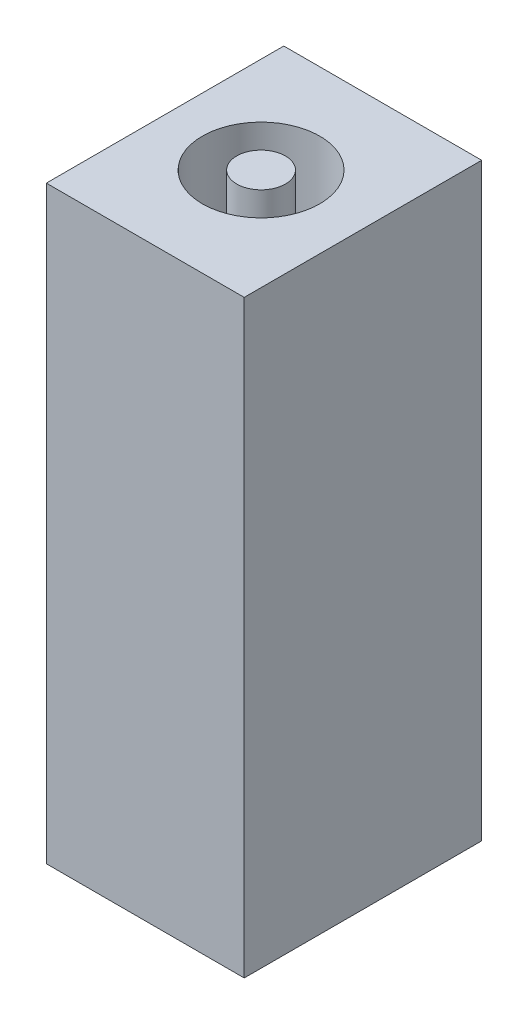
ISO-10303-21;
HEADER;
FILE_DESCRIPTION(('STEP AP214'),'2;1');
FILE_NAME('part.step','',(''),(''),'','','');
FILE_SCHEMA(('AUTOMOTIVE_DESIGN { 1 0 10303 214 1 1 1 1 }'));
ENDSEC;
DATA;
#1=APPLICATION_CONTEXT('core data for automotive mechanical design processes');
#2=APPLICATION_PROTOCOL_DEFINITION('international standard','automotive_design',2000,#1);
#3=PRODUCT_CONTEXT('',#1,'mechanical');
#4=PRODUCT('Part','Part','',(#3));
#5=PRODUCT_RELATED_PRODUCT_CATEGORY('part','',(#4));
#6=PRODUCT_DEFINITION_FORMATION('','',#4);
#7=PRODUCT_DEFINITION_CONTEXT('part definition',#1,'design');
#8=PRODUCT_DEFINITION('design','',#6,#7);
#9=PRODUCT_DEFINITION_SHAPE('','',#8);
#10=(LENGTH_UNIT() NAMED_UNIT(*) SI_UNIT(.MILLI.,.METRE.));
#11=(NAMED_UNIT(*) PLANE_ANGLE_UNIT() SI_UNIT($,.RADIAN.));
#12=(NAMED_UNIT(*) SI_UNIT($,.STERADIAN.) SOLID_ANGLE_UNIT());
#13=UNCERTAINTY_MEASURE_WITH_UNIT(LENGTH_MEASURE(1.E-05),#10,'distance_accuracy_value','');
#14=(GEOMETRIC_REPRESENTATION_CONTEXT(3) GLOBAL_UNCERTAINTY_ASSIGNED_CONTEXT((#13)) GLOBAL_UNIT_ASSIGNED_CONTEXT((#10,
#11,#12)) REPRESENTATION_CONTEXT('',''));
#15=CARTESIAN_POINT('',(0.,0.,0.));
#16=DIRECTION('',(0.,0.,1.));
#17=DIRECTION('',(1.,0.,0.));
#18=AXIS2_PLACEMENT_3D('',#15,#16,#17);
#19=CARTESIAN_POINT('',(25.,37.2340425531915,-15.));
#20=DIRECTION('',(0.,0.,1.));
#21=DIRECTION('',(0.,-1.,0.));
#22=AXIS2_PLACEMENT_3D('',#19,#20,#21);
#23=PLANE('',#22);
#24=DIRECTION('',(0.,1.,0.));
#25=VECTOR('',#24,1.);
#26=CARTESIAN_POINT('',(0.,37.2340425531915,-15.));
#27=LINE('',#26,#25);
#28=CARTESIAN_POINT('',(0.,-37.2340425531915,-15.));
#29=VERTEX_POINT('',#28);
#30=CARTESIAN_POINT('',(0.,37.2340425531915,-15.));
#31=VERTEX_POINT('',#30);
#32=EDGE_CURVE('E111',#29,#31,#27,.T.);
#33=ORIENTED_EDGE('',*,*,#32,.T.);
#34=DIRECTION('',(-1.,0.,0.));
#35=VECTOR('',#34,1.);
#36=CARTESIAN_POINT('',(25.,37.2340425531915,-15.));
#37=LINE('',#36,#35);
#38=CARTESIAN_POINT('',(25.,37.2340425531915,-15.));
#39=VERTEX_POINT('',#38);
#40=EDGE_CURVE('E11',#39,#31,#37,.T.);
#41=ORIENTED_EDGE('',*,*,#40,.F.);
#42=DIRECTION('',(0.,1.,0.));
#43=VECTOR('',#42,1.);
#44=CARTESIAN_POINT('',(25.,37.2340425531915,-15.));
#45=LINE('',#44,#43);
#46=CARTESIAN_POINT('',(25.,-37.2340425531915,-15.));
#47=VERTEX_POINT('',#46);
#48=EDGE_CURVE('E95',#47,#39,#45,.T.);
#49=ORIENTED_EDGE('',*,*,#48,.F.);
#50=DIRECTION('',(-1.,0.,0.));
#51=VECTOR('',#50,1.);
#52=CARTESIAN_POINT('',(25.,-37.2340425531915,-15.));
#53=LINE('',#52,#51);
#54=EDGE_CURVE('E107',#47,#29,#53,.T.);
#55=ORIENTED_EDGE('',*,*,#54,.T.);
#56=EDGE_LOOP('',(#33,#41,#49,#55));
#57=FACE_BOUND('',#56,.T.);
#58=ADVANCED_FACE('F43',(#57),#23,.F.);
#59=CARTESIAN_POINT('',(25.,37.2340425531915,15.));
#60=DIRECTION('',(0.,-1.,0.));
#61=DIRECTION('',(0.,0.,-1.));
#62=AXIS2_PLACEMENT_3D('',#59,#60,#61);
#63=PLANE('',#62);
#64=CARTESIAN_POINT('',(12.1285508275323,37.2340425531915,0.));
#65=DIRECTION('',(0.,1.,0.));
#66=DIRECTION('',(0.,0.,1.));
#67=AXIS2_PLACEMENT_3D('',#64,#65,#66);
#68=CIRCLE('',#67,7.415);
#69=CARTESIAN_POINT('',(12.1285508275323,37.2340425531915,7.415));
#70=VERTEX_POINT('',#69);
#71=EDGE_CURVE('E132',#70,#70,#68,.T.);
#72=ORIENTED_EDGE('',*,*,#71,.F.);
#73=EDGE_LOOP('',(#72));
#74=FACE_BOUND('',#73,.T.);
#75=DIRECTION('',(0.,0.,1.));
#76=VECTOR('',#75,1.);
#77=CARTESIAN_POINT('',(0.,37.2340425531915,15.));
#78=LINE('',#77,#76);
#79=CARTESIAN_POINT('',(0.,37.2340425531915,15.));
#80=VERTEX_POINT('',#79);
#81=EDGE_CURVE('E100',#31,#80,#78,.T.);
#82=ORIENTED_EDGE('',*,*,#81,.T.);
#83=DIRECTION('',(-1.,0.,0.));
#84=VECTOR('',#83,1.);
#85=CARTESIAN_POINT('',(25.,37.2340425531915,15.));
#86=LINE('',#85,#84);
#87=CARTESIAN_POINT('',(25.,37.2340425531915,15.));
#88=VERTEX_POINT('',#87);
#89=EDGE_CURVE('E52',#88,#80,#86,.T.);
#90=ORIENTED_EDGE('',*,*,#89,.F.);
#91=DIRECTION('',(0.,0.,1.));
#92=VECTOR('',#91,1.);
#93=CARTESIAN_POINT('',(25.,37.2340425531915,15.));
#94=LINE('',#93,#92);
#95=EDGE_CURVE('E90',#39,#88,#94,.T.);
#96=ORIENTED_EDGE('',*,*,#95,.F.);
#97=ORIENTED_EDGE('',*,*,#40,.T.);
#98=EDGE_LOOP('',(#82,#90,#96,#97));
#99=FACE_BOUND('',#98,.T.);
#100=ADVANCED_FACE('F99',(#74,#99),#63,.F.);
#101=CARTESIAN_POINT('',(25.,37.2340425531915,15.));
#102=DIRECTION('',(0.,0.,-1.));
#103=DIRECTION('',(0.,1.,0.));
#104=AXIS2_PLACEMENT_3D('',#101,#102,#103);
#105=PLANE('',#104);
#106=DIRECTION('',(0.,-1.,0.));
#107=VECTOR('',#106,1.);
#108=CARTESIAN_POINT('',(0.,37.2340425531915,15.));
#109=LINE('',#108,#107);
#110=CARTESIAN_POINT('',(0.,-37.2340425531915,15.));
#111=VERTEX_POINT('',#110);
#112=EDGE_CURVE('E77',#80,#111,#109,.T.);
#113=ORIENTED_EDGE('',*,*,#112,.T.);
#114=DIRECTION('',(-1.,0.,0.));
#115=VECTOR('',#114,1.);
#116=CARTESIAN_POINT('',(25.,-37.2340425531915,15.));
#117=LINE('',#116,#115);
#118=CARTESIAN_POINT('',(25.,-37.2340425531915,15.));
#119=VERTEX_POINT('',#118);
#120=EDGE_CURVE('E102',#119,#111,#117,.T.);
#121=ORIENTED_EDGE('',*,*,#120,.F.);
#122=DIRECTION('',(0.,-1.,0.));
#123=VECTOR('',#122,1.);
#124=CARTESIAN_POINT('',(25.,37.2340425531915,15.));
#125=LINE('',#124,#123);
#126=EDGE_CURVE('E93',#88,#119,#125,.T.);
#127=ORIENTED_EDGE('',*,*,#126,.F.);
#128=ORIENTED_EDGE('',*,*,#89,.T.);
#129=EDGE_LOOP('',(#113,#121,#127,#128));
#130=FACE_BOUND('',#129,.T.);
#131=ADVANCED_FACE('F103',(#130),#105,.F.);
#132=CARTESIAN_POINT('',(25.,-37.2340425531915,15.));
#133=DIRECTION('',(0.,1.,0.));
#134=DIRECTION('',(0.,0.,1.));
#135=AXIS2_PLACEMENT_3D('',#132,#133,#134);
#136=PLANE('',#135);
#137=DIRECTION('',(0.,0.,-1.));
#138=VECTOR('',#137,1.);
#139=CARTESIAN_POINT('',(0.,-37.2340425531915,15.));
#140=LINE('',#139,#138);
#141=EDGE_CURVE('E83',#111,#29,#140,.T.);
#142=ORIENTED_EDGE('',*,*,#141,.T.);
#143=ORIENTED_EDGE('',*,*,#54,.F.);
#144=DIRECTION('',(0.,0.,-1.));
#145=VECTOR('',#144,1.);
#146=CARTESIAN_POINT('',(25.,-37.2340425531915,15.));
#147=LINE('',#146,#145);
#148=EDGE_CURVE('E60',#119,#47,#147,.T.);
#149=ORIENTED_EDGE('',*,*,#148,.F.);
#150=ORIENTED_EDGE('',*,*,#120,.T.);
#151=EDGE_LOOP('',(#142,#143,#149,#150));
#152=FACE_BOUND('',#151,.T.);
#153=ADVANCED_FACE('F125',(#152),#136,.F.);
#154=CARTESIAN_POINT('',(25.,0.,0.));
#155=DIRECTION('',(1.,0.,0.));
#156=DIRECTION('',(0.,0.,-1.));
#157=AXIS2_PLACEMENT_3D('',#154,#155,#156);
#158=PLANE('',#157);
#159=ORIENTED_EDGE('',*,*,#48,.T.);
#160=ORIENTED_EDGE('',*,*,#95,.T.);
#161=ORIENTED_EDGE('',*,*,#126,.T.);
#162=ORIENTED_EDGE('',*,*,#148,.T.);
#163=EDGE_LOOP('',(#159,#160,#161,#162));
#164=FACE_BOUND('',#163,.T.);
#165=ADVANCED_FACE('F91',(#164),#158,.T.);
#166=CARTESIAN_POINT('',(0.,0.,0.));
#167=DIRECTION('',(1.,0.,0.));
#168=DIRECTION('',(0.,0.,-1.));
#169=AXIS2_PLACEMENT_3D('',#166,#167,#168);
#170=PLANE('',#169);
#171=ORIENTED_EDGE('',*,*,#32,.F.);
#172=ORIENTED_EDGE('',*,*,#141,.F.);
#173=ORIENTED_EDGE('',*,*,#112,.F.);
#174=ORIENTED_EDGE('',*,*,#81,.F.);
#175=EDGE_LOOP('',(#171,#172,#173,#174));
#176=FACE_BOUND('',#175,.T.);
#177=ADVANCED_FACE('F128',(#176),#170,.F.);
#178=CARTESIAN_POINT('',(12.1285508275323,-27.4659574468085,0.));
#179=DIRECTION('',(0.,1.,0.));
#180=DIRECTION('',(0.,0.,1.));
#181=AXIS2_PLACEMENT_3D('',#178,#179,#180);
#182=CYLINDRICAL_SURFACE('',#181,7.415);
#183=CARTESIAN_POINT('',(12.1285508275323,-27.4659574468085,0.));
#184=DIRECTION('',(0.,1.,0.));
#185=DIRECTION('',(0.,0.,1.));
#186=AXIS2_PLACEMENT_3D('',#183,#184,#185);
#187=CIRCLE('',#186,7.415);
#188=CARTESIAN_POINT('',(12.1285508275323,-27.4659574468085,7.415));
#189=VERTEX_POINT('',#188);
#190=EDGE_CURVE('E115',#189,#189,#187,.T.);
#191=CARTESIAN_POINT('',(12.1285508275323,-27.4659574468085,7.415));
#192=CARTESIAN_POINT('',(12.1285508275323,-26.7919991134751,7.415));
#193=CARTESIAN_POINT('',(12.1285508275323,-26.1180407801418,7.415));
#194=CARTESIAN_POINT('',(12.1285508275323,-24.7701241134751,7.415));
#195=CARTESIAN_POINT('',(12.1285508275323,-24.0961657801418,7.415));
#196=CARTESIAN_POINT('',(12.1285508275323,-22.7482491134751,7.415));
#197=CARTESIAN_POINT('',(12.1285508275323,-22.0742907801418,7.415));
#198=CARTESIAN_POINT('',(12.1285508275323,-20.7263741134751,7.415));
#199=CARTESIAN_POINT('',(12.1285508275323,-20.0524157801418,7.415));
#200=CARTESIAN_POINT('',(12.1285508275323,-18.7044991134751,7.415));
#201=CARTESIAN_POINT('',(12.1285508275323,-18.0305407801418,7.415));
#202=CARTESIAN_POINT('',(12.1285508275323,-16.6826241134751,7.415));
#203=CARTESIAN_POINT('',(12.1285508275323,-16.0086657801418,7.415));
#204=CARTESIAN_POINT('',(12.1285508275323,-14.6607491134751,7.415));
#205=CARTESIAN_POINT('',(12.1285508275323,-13.9867907801418,7.415));
#206=CARTESIAN_POINT('',(12.1285508275323,-12.6388741134751,7.415));
#207=CARTESIAN_POINT('',(12.1285508275323,-11.9649157801418,7.415));
#208=CARTESIAN_POINT('',(12.1285508275323,-10.6169991134751,7.415));
#209=CARTESIAN_POINT('',(12.1285508275323,-9.9430407801418,7.415));
#210=CARTESIAN_POINT('',(12.1285508275323,-8.59512411347514,7.415));
#211=CARTESIAN_POINT('',(12.1285508275323,-7.9211657801418,7.415));
#212=CARTESIAN_POINT('',(12.1285508275323,-6.57324911347514,7.415));
#213=CARTESIAN_POINT('',(12.1285508275323,-5.8992907801418,7.415));
#214=CARTESIAN_POINT('',(12.1285508275323,-4.55137411347514,7.415));
#215=CARTESIAN_POINT('',(12.1285508275323,-3.8774157801418,7.415));
#216=CARTESIAN_POINT('',(12.1285508275323,-2.52949911347514,7.415));
#217=CARTESIAN_POINT('',(12.1285508275323,-1.8555407801418,7.415));
#218=CARTESIAN_POINT('',(12.1285508275323,-0.507624113475135,7.415));
#219=CARTESIAN_POINT('',(12.1285508275323,0.166334219858199,7.415));
#220=CARTESIAN_POINT('',(12.1285508275323,1.51425088652487,7.415));
#221=CARTESIAN_POINT('',(12.1285508275323,2.1882092198582,7.415));
#222=CARTESIAN_POINT('',(12.1285508275323,3.53612588652487,7.415));
#223=CARTESIAN_POINT('',(12.1285508275323,4.2100842198582,7.415));
#224=CARTESIAN_POINT('',(12.1285508275323,5.55800088652486,7.415));
#225=CARTESIAN_POINT('',(12.1285508275323,6.2319592198582,7.415));
#226=CARTESIAN_POINT('',(12.1285508275323,7.57987588652486,7.415));
#227=CARTESIAN_POINT('',(12.1285508275323,8.2538342198582,7.415));
#228=CARTESIAN_POINT('',(12.1285508275323,9.60175088652487,7.415));
#229=CARTESIAN_POINT('',(12.1285508275323,10.2757092198582,7.415));
#230=CARTESIAN_POINT('',(12.1285508275323,11.6236258865249,7.415));
#231=CARTESIAN_POINT('',(12.1285508275323,12.2975842198582,7.415));
#232=CARTESIAN_POINT('',(12.1285508275323,13.6455008865249,7.415));
#233=CARTESIAN_POINT('',(12.1285508275323,14.3194592198582,7.415));
#234=CARTESIAN_POINT('',(12.1285508275323,15.6673758865249,7.415));
#235=CARTESIAN_POINT('',(12.1285508275323,16.3413342198582,7.415));
#236=CARTESIAN_POINT('',(12.1285508275323,17.6892508865249,7.415));
#237=CARTESIAN_POINT('',(12.1285508275323,18.3632092198582,7.415));
#238=CARTESIAN_POINT('',(12.1285508275323,19.7111258865249,7.415));
#239=CARTESIAN_POINT('',(12.1285508275323,20.3850842198582,7.415));
#240=CARTESIAN_POINT('',(12.1285508275323,21.7330008865249,7.415));
#241=CARTESIAN_POINT('',(12.1285508275323,22.4069592198582,7.415));
#242=CARTESIAN_POINT('',(12.1285508275323,23.7548758865249,7.415));
#243=CARTESIAN_POINT('',(12.1285508275323,24.4288342198582,7.415));
#244=CARTESIAN_POINT('',(12.1285508275323,25.7767508865249,7.415));
#245=CARTESIAN_POINT('',(12.1285508275323,26.4507092198582,7.415));
#246=CARTESIAN_POINT('',(12.1285508275323,27.7986258865249,7.415));
#247=CARTESIAN_POINT('',(12.1285508275323,28.4725842198582,7.415));
#248=CARTESIAN_POINT('',(12.1285508275323,29.8205008865249,7.415));
#249=CARTESIAN_POINT('',(12.1285508275323,30.4944592198582,7.415));
#250=CARTESIAN_POINT('',(12.1285508275323,31.8423758865249,7.415));
#251=CARTESIAN_POINT('',(12.1285508275323,32.5163342198582,7.415));
#252=CARTESIAN_POINT('',(12.1285508275323,33.8642508865249,7.415));
#253=CARTESIAN_POINT('',(12.1285508275323,34.5382092198582,7.415));
#254=CARTESIAN_POINT('',(12.1285508275323,35.8861258865249,7.415));
#255=CARTESIAN_POINT('',(12.1285508275323,36.5600842198582,7.415));
#256=CARTESIAN_POINT('',(12.1285508275323,37.2340425531915,7.415));
#257=B_SPLINE_CURVE_WITH_KNOTS('',3,(#191,#192,#193,#194,#195,#196,#197,#198,#199,#200,#201,
#202,#203,#204,#205,#206,#207,#208,#209,#210,#211,#212,#213,#214,#215,#216,#217,#218,#219,#220,
#221,#222,#223,#224,#225,#226,#227,#228,#229,#230,#231,#232,#233,#234,#235,#236,#237,#238,#239,
#240,#241,#242,#243,#244,#245,#246,#247,#248,#249,#250,#251,#252,#253,#254,#255,#256),
.UNSPECIFIED.,.F.,.F.,(4,2,2,2,2,2,2,2,2,2,2,2,2,2,2,2,2,2,2,2,2,2,2,2,2,2,2,2,2,2,2,2,4),(0.,
2.021875,4.04375,6.065625,8.0875,10.109375,12.13125,14.153125,16.175,18.196875,20.21875,
22.240625,24.2625,26.284375,28.30625,30.328125,32.35,34.371875,36.39375,38.415625,40.4375,
42.459375,44.48125,46.503125,48.525,50.546875,52.56875,54.590625,56.6125,58.634375,60.65625,
62.678125,64.7),.UNSPECIFIED.);
#258=EDGE_CURVE('BSEAM154',#189,#70,#257,.T.);
#259=ORIENTED_EDGE('',*,*,#190,.F.);
#260=ORIENTED_EDGE('',*,*,#71,.T.);
#261=ORIENTED_EDGE('',*,*,#258,.T.);
#262=ORIENTED_EDGE('',*,*,#258,.F.);
#263=EDGE_LOOP('',(#259,#261,#260,#262));
#264=FACE_BOUND('',#263,.T.);
#265=ADVANCED_FACE('F154',(#264),#182,.F.);
#266=CARTESIAN_POINT('',(12.1285508275323,-27.4659574468085,0.));
#267=DIRECTION('',(0.,1.,0.));
#268=DIRECTION('',(0.,0.,1.));
#269=AXIS2_PLACEMENT_3D('',#266,#267,#268);
#270=PLANE('',#269);
#271=CARTESIAN_POINT('',(12.1285508275323,-27.4659574468085,0.));
#272=DIRECTION('',(0.,1.,0.));
#273=DIRECTION('',(0.,0.,1.));
#274=AXIS2_PLACEMENT_3D('',#271,#272,#273);
#275=CIRCLE('',#274,3.075);
#276=CARTESIAN_POINT('',(12.1285508275323,-27.4659574468085,3.075));
#277=VERTEX_POINT('',#276);
#278=EDGE_CURVE('E136',#277,#277,#275,.T.);
#279=ORIENTED_EDGE('',*,*,#278,.F.);
#280=EDGE_LOOP('',(#279));
#281=FACE_BOUND('',#280,.T.);
#282=ORIENTED_EDGE('',*,*,#190,.T.);
#283=EDGE_LOOP('',(#282));
#284=FACE_BOUND('',#283,.T.);
#285=ADVANCED_FACE('F151',(#281,#284),#270,.T.);
#286=CARTESIAN_POINT('',(12.1285508275323,-27.4659574468085,0.));
#287=DIRECTION('',(0.,1.,0.));
#288=DIRECTION('',(0.,0.,1.));
#289=AXIS2_PLACEMENT_3D('',#286,#287,#288);
#290=CYLINDRICAL_SURFACE('',#289,3.075);
#291=CARTESIAN_POINT('',(12.1285508275323,37.2340425531915,0.));
#292=DIRECTION('',(0.,1.,0.));
#293=DIRECTION('',(0.,0.,1.));
#294=AXIS2_PLACEMENT_3D('',#291,#292,#293);
#295=CIRCLE('',#294,3.075);
#296=CARTESIAN_POINT('',(12.1285508275323,37.2340425531915,3.075));
#297=VERTEX_POINT('',#296);
#298=EDGE_CURVE('E140',#297,#297,#295,.T.);
#299=CARTESIAN_POINT('',(12.1285508275323,-27.4659574468085,3.075));
#300=CARTESIAN_POINT('',(12.1285508275323,-26.7919991134751,3.075));
#301=CARTESIAN_POINT('',(12.1285508275323,-26.1180407801418,3.075));
#302=CARTESIAN_POINT('',(12.1285508275323,-24.7701241134751,3.075));
#303=CARTESIAN_POINT('',(12.1285508275323,-24.0961657801418,3.075));
#304=CARTESIAN_POINT('',(12.1285508275323,-22.7482491134751,3.075));
#305=CARTESIAN_POINT('',(12.1285508275323,-22.0742907801418,3.075));
#306=CARTESIAN_POINT('',(12.1285508275323,-20.7263741134751,3.075));
#307=CARTESIAN_POINT('',(12.1285508275323,-20.0524157801418,3.075));
#308=CARTESIAN_POINT('',(12.1285508275323,-18.7044991134751,3.075));
#309=CARTESIAN_POINT('',(12.1285508275323,-18.0305407801418,3.075));
#310=CARTESIAN_POINT('',(12.1285508275323,-16.6826241134751,3.075));
#311=CARTESIAN_POINT('',(12.1285508275323,-16.0086657801418,3.075));
#312=CARTESIAN_POINT('',(12.1285508275323,-14.6607491134751,3.075));
#313=CARTESIAN_POINT('',(12.1285508275323,-13.9867907801418,3.075));
#314=CARTESIAN_POINT('',(12.1285508275323,-12.6388741134751,3.075));
#315=CARTESIAN_POINT('',(12.1285508275323,-11.9649157801418,3.075));
#316=CARTESIAN_POINT('',(12.1285508275323,-10.6169991134751,3.075));
#317=CARTESIAN_POINT('',(12.1285508275323,-9.9430407801418,3.075));
#318=CARTESIAN_POINT('',(12.1285508275323,-8.59512411347514,3.075));
#319=CARTESIAN_POINT('',(12.1285508275323,-7.9211657801418,3.075));
#320=CARTESIAN_POINT('',(12.1285508275323,-6.57324911347514,3.075));
#321=CARTESIAN_POINT('',(12.1285508275323,-5.8992907801418,3.075));
#322=CARTESIAN_POINT('',(12.1285508275323,-4.55137411347514,3.075));
#323=CARTESIAN_POINT('',(12.1285508275323,-3.8774157801418,3.075));
#324=CARTESIAN_POINT('',(12.1285508275323,-2.52949911347514,3.075));
#325=CARTESIAN_POINT('',(12.1285508275323,-1.8555407801418,3.075));
#326=CARTESIAN_POINT('',(12.1285508275323,-0.507624113475135,3.075));
#327=CARTESIAN_POINT('',(12.1285508275323,0.166334219858199,3.075));
#328=CARTESIAN_POINT('',(12.1285508275323,1.51425088652487,3.075));
#329=CARTESIAN_POINT('',(12.1285508275323,2.1882092198582,3.075));
#330=CARTESIAN_POINT('',(12.1285508275323,3.53612588652487,3.075));
#331=CARTESIAN_POINT('',(12.1285508275323,4.2100842198582,3.075));
#332=CARTESIAN_POINT('',(12.1285508275323,5.55800088652486,3.075));
#333=CARTESIAN_POINT('',(12.1285508275323,6.2319592198582,3.075));
#334=CARTESIAN_POINT('',(12.1285508275323,7.57987588652486,3.075));
#335=CARTESIAN_POINT('',(12.1285508275323,8.2538342198582,3.075));
#336=CARTESIAN_POINT('',(12.1285508275323,9.60175088652487,3.075));
#337=CARTESIAN_POINT('',(12.1285508275323,10.2757092198582,3.075));
#338=CARTESIAN_POINT('',(12.1285508275323,11.6236258865249,3.075));
#339=CARTESIAN_POINT('',(12.1285508275323,12.2975842198582,3.075));
#340=CARTESIAN_POINT('',(12.1285508275323,13.6455008865249,3.075));
#341=CARTESIAN_POINT('',(12.1285508275323,14.3194592198582,3.075));
#342=CARTESIAN_POINT('',(12.1285508275323,15.6673758865249,3.075));
#343=CARTESIAN_POINT('',(12.1285508275323,16.3413342198582,3.075));
#344=CARTESIAN_POINT('',(12.1285508275323,17.6892508865249,3.075));
#345=CARTESIAN_POINT('',(12.1285508275323,18.3632092198582,3.075));
#346=CARTESIAN_POINT('',(12.1285508275323,19.7111258865249,3.075));
#347=CARTESIAN_POINT('',(12.1285508275323,20.3850842198582,3.075));
#348=CARTESIAN_POINT('',(12.1285508275323,21.7330008865249,3.075));
#349=CARTESIAN_POINT('',(12.1285508275323,22.4069592198582,3.075));
#350=CARTESIAN_POINT('',(12.1285508275323,23.7548758865249,3.075));
#351=CARTESIAN_POINT('',(12.1285508275323,24.4288342198582,3.075));
#352=CARTESIAN_POINT('',(12.1285508275323,25.7767508865249,3.075));
#353=CARTESIAN_POINT('',(12.1285508275323,26.4507092198582,3.075));
#354=CARTESIAN_POINT('',(12.1285508275323,27.7986258865249,3.075));
#355=CARTESIAN_POINT('',(12.1285508275323,28.4725842198582,3.075));
#356=CARTESIAN_POINT('',(12.1285508275323,29.8205008865249,3.075));
#357=CARTESIAN_POINT('',(12.1285508275323,30.4944592198582,3.075));
#358=CARTESIAN_POINT('',(12.1285508275323,31.8423758865249,3.075));
#359=CARTESIAN_POINT('',(12.1285508275323,32.5163342198582,3.075));
#360=CARTESIAN_POINT('',(12.1285508275323,33.8642508865249,3.075));
#361=CARTESIAN_POINT('',(12.1285508275323,34.5382092198582,3.075));
#362=CARTESIAN_POINT('',(12.1285508275323,35.8861258865249,3.075));
#363=CARTESIAN_POINT('',(12.1285508275323,36.5600842198582,3.075));
#364=CARTESIAN_POINT('',(12.1285508275323,37.2340425531915,3.075));
#365=B_SPLINE_CURVE_WITH_KNOTS('',3,(#299,#300,#301,#302,#303,#304,#305,#306,#307,#308,#309,
#310,#311,#312,#313,#314,#315,#316,#317,#318,#319,#320,#321,#322,#323,#324,#325,#326,#327,#328,
#329,#330,#331,#332,#333,#334,#335,#336,#337,#338,#339,#340,#341,#342,#343,#344,#345,#346,#347,
#348,#349,#350,#351,#352,#353,#354,#355,#356,#357,#358,#359,#360,#361,#362,#363,#364),
.UNSPECIFIED.,.F.,.F.,(4,2,2,2,2,2,2,2,2,2,2,2,2,2,2,2,2,2,2,2,2,2,2,2,2,2,2,2,2,2,2,2,4),(0.,
2.021875,4.04375,6.065625,8.0875,10.109375,12.13125,14.153125,16.175,18.196875,20.21875,
22.240625,24.2625,26.284375,28.30625,30.328125,32.35,34.371875,36.39375,38.415625,40.4375,
42.459375,44.48125,46.503125,48.525,50.546875,52.56875,54.590625,56.6125,58.634375,60.65625,
62.678125,64.7),.UNSPECIFIED.);
#366=EDGE_CURVE('BSEAM148',#277,#297,#365,.T.);
#367=ORIENTED_EDGE('',*,*,#278,.T.);
#368=ORIENTED_EDGE('',*,*,#298,.F.);
#369=ORIENTED_EDGE('',*,*,#366,.T.);
#370=ORIENTED_EDGE('',*,*,#366,.F.);
#371=EDGE_LOOP('',(#367,#369,#368,#370));
#372=FACE_BOUND('',#371,.T.);
#373=ADVANCED_FACE('F148',(#372),#290,.T.);
#374=ORIENTED_EDGE('',*,*,#298,.T.);
#375=EDGE_LOOP('',(#374));
#376=FACE_BOUND('',#375,.T.);
#377=ADVANCED_FACE('F164',(#376),#63,.F.);
#378=CLOSED_SHELL('',(#58,#100,#131,#153,#165,#177,#265,#285,#373,#377));
#379=MANIFOLD_SOLID_BREP('B2',#378);
#380=ADVANCED_BREP_SHAPE_REPRESENTATION('',(#18,#379),#14);
#381=SHAPE_DEFINITION_REPRESENTATION(#9,#380);
ENDSEC;
END-ISO-10303-21;
